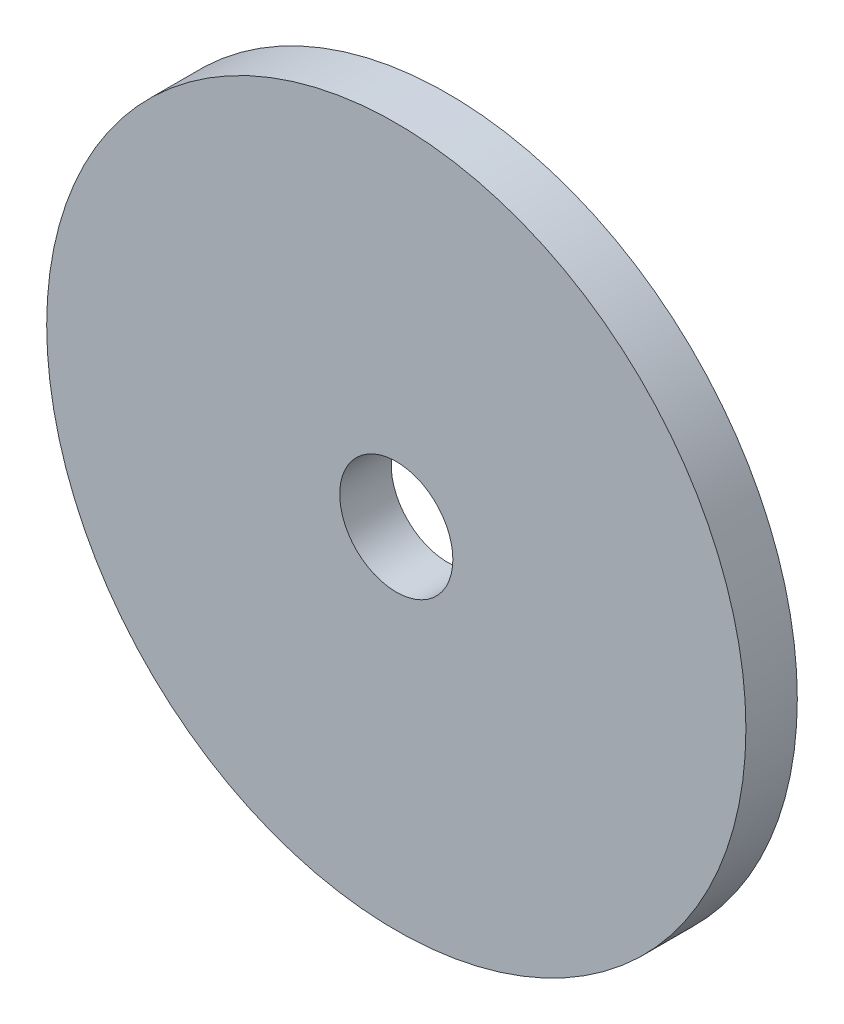
ISO-10303-21;
HEADER;
FILE_DESCRIPTION(('STEP AP214'),'2;1');
FILE_NAME('part.step','',(''),(''),'','','');
FILE_SCHEMA(('AUTOMOTIVE_DESIGN { 1 0 10303 214 1 1 1 1 }'));
ENDSEC;
DATA;
#1=APPLICATION_CONTEXT('core data for automotive mechanical design processes');
#2=APPLICATION_PROTOCOL_DEFINITION('international standard','automotive_design',2000,#1);
#3=PRODUCT_CONTEXT('',#1,'mechanical');
#4=PRODUCT('Part','Part','',(#3));
#5=PRODUCT_RELATED_PRODUCT_CATEGORY('part','',(#4));
#6=PRODUCT_DEFINITION_FORMATION('','',#4);
#7=PRODUCT_DEFINITION_CONTEXT('part definition',#1,'design');
#8=PRODUCT_DEFINITION('design','',#6,#7);
#9=PRODUCT_DEFINITION_SHAPE('','',#8);
#10=(LENGTH_UNIT() NAMED_UNIT(*) SI_UNIT(.MILLI.,.METRE.));
#11=(NAMED_UNIT(*) PLANE_ANGLE_UNIT() SI_UNIT($,.RADIAN.));
#12=(NAMED_UNIT(*) SI_UNIT($,.STERADIAN.) SOLID_ANGLE_UNIT());
#13=UNCERTAINTY_MEASURE_WITH_UNIT(LENGTH_MEASURE(1.E-05),#10,'distance_accuracy_value','');
#14=(GEOMETRIC_REPRESENTATION_CONTEXT(3) GLOBAL_UNCERTAINTY_ASSIGNED_CONTEXT((#13)) GLOBAL_UNIT_ASSIGNED_CONTEXT((#10,
#11,#12)) REPRESENTATION_CONTEXT('',''));
#15=CARTESIAN_POINT('',(0.,0.,0.));
#16=DIRECTION('',(0.,0.,1.));
#17=DIRECTION('',(1.,0.,0.));
#18=AXIS2_PLACEMENT_3D('',#15,#16,#17);
#19=CARTESIAN_POINT('',(0.,0.,5.));
#20=DIRECTION('',(0.,0.,1.));
#21=DIRECTION('',(1.,0.,0.));
#22=AXIS2_PLACEMENT_3D('',#19,#20,#21);
#23=PLANE('',#22);
#24=CARTESIAN_POINT('',(0.,0.,5.));
#25=DIRECTION('',(0.,0.,1.));
#26=DIRECTION('',(1.,0.,0.));
#27=AXIS2_PLACEMENT_3D('',#24,#25,#26);
#28=CIRCLE('',#27,34.);
#29=CARTESIAN_POINT('',(34.,0.,5.));
#30=VERTEX_POINT('',#29);
#31=EDGE_CURVE('E10',#30,#30,#28,.T.);
#32=ORIENTED_EDGE('',*,*,#31,.T.);
#33=EDGE_LOOP('',(#32));
#34=FACE_BOUND('',#33,.T.);
#35=CARTESIAN_POINT('',(0.,0.,5.));
#36=DIRECTION('',(0.,0.,1.));
#37=DIRECTION('',(1.,0.,0.));
#38=AXIS2_PLACEMENT_3D('',#35,#36,#37);
#39=CIRCLE('',#38,5.5);
#40=CARTESIAN_POINT('',(5.5,0.,5.));
#41=VERTEX_POINT('',#40);
#42=EDGE_CURVE('E56',#41,#41,#39,.T.);
#43=ORIENTED_EDGE('',*,*,#42,.F.);
#44=EDGE_LOOP('',(#43));
#45=FACE_BOUND('',#44,.T.);
#46=ADVANCED_FACE('F42',(#34,#45),#23,.T.);
#47=CARTESIAN_POINT('',(0.,0.,0.));
#48=DIRECTION('',(0.,0.,1.));
#49=DIRECTION('',(1.,0.,0.));
#50=AXIS2_PLACEMENT_3D('',#47,#48,#49);
#51=PLANE('',#50);
#52=CARTESIAN_POINT('',(0.,0.,0.));
#53=DIRECTION('',(0.,0.,1.));
#54=DIRECTION('',(1.,0.,0.));
#55=AXIS2_PLACEMENT_3D('',#52,#53,#54);
#56=CIRCLE('',#55,34.);
#57=CARTESIAN_POINT('',(34.,0.,0.));
#58=VERTEX_POINT('',#57);
#59=EDGE_CURVE('E46',#58,#58,#56,.T.);
#60=ORIENTED_EDGE('',*,*,#59,.F.);
#61=EDGE_LOOP('',(#60));
#62=FACE_BOUND('',#61,.T.);
#63=CARTESIAN_POINT('',(0.,0.,0.));
#64=DIRECTION('',(0.,0.,1.));
#65=DIRECTION('',(1.,0.,0.));
#66=AXIS2_PLACEMENT_3D('',#63,#64,#65);
#67=CIRCLE('',#66,5.5);
#68=CARTESIAN_POINT('',(5.5,0.,0.));
#69=VERTEX_POINT('',#68);
#70=EDGE_CURVE('E58',#69,#69,#67,.T.);
#71=ORIENTED_EDGE('',*,*,#70,.T.);
#72=EDGE_LOOP('',(#71));
#73=FACE_BOUND('',#72,.T.);
#74=ADVANCED_FACE('F71',(#62,#73),#51,.F.);
#75=CARTESIAN_POINT('',(0.,0.,5.));
#76=DIRECTION('',(0.,0.,-1.));
#77=DIRECTION('',(-1.,0.,0.));
#78=AXIS2_PLACEMENT_3D('',#75,#76,#77);
#79=CYLINDRICAL_SURFACE('',#78,34.);
#80=ORIENTED_EDGE('',*,*,#31,.F.);
#81=EDGE_LOOP('',(#80));
#82=FACE_BOUND('',#81,.T.);
#83=ORIENTED_EDGE('',*,*,#59,.T.);
#84=EDGE_LOOP('',(#83));
#85=FACE_BOUND('',#84,.T.);
#86=ADVANCED_FACE('F44',(#82,#85),#79,.T.);
#87=CARTESIAN_POINT('',(0.,0.,5.));
#88=DIRECTION('',(0.,0.,-1.));
#89=DIRECTION('',(-1.,0.,0.));
#90=AXIS2_PLACEMENT_3D('',#87,#88,#89);
#91=CYLINDRICAL_SURFACE('',#90,5.5);
#92=ORIENTED_EDGE('',*,*,#42,.T.);
#93=EDGE_LOOP('',(#92));
#94=FACE_BOUND('',#93,.T.);
#95=ORIENTED_EDGE('',*,*,#70,.F.);
#96=EDGE_LOOP('',(#95));
#97=FACE_BOUND('',#96,.T.);
#98=ADVANCED_FACE('F67',(#94,#97),#91,.F.);
#99=CLOSED_SHELL('',(#46,#74,#86,#98));
#100=MANIFOLD_SOLID_BREP('B2',#99);
#101=ADVANCED_BREP_SHAPE_REPRESENTATION('',(#18,#100),#14);
#102=SHAPE_DEFINITION_REPRESENTATION(#9,#101);
ENDSEC;
END-ISO-10303-21;
